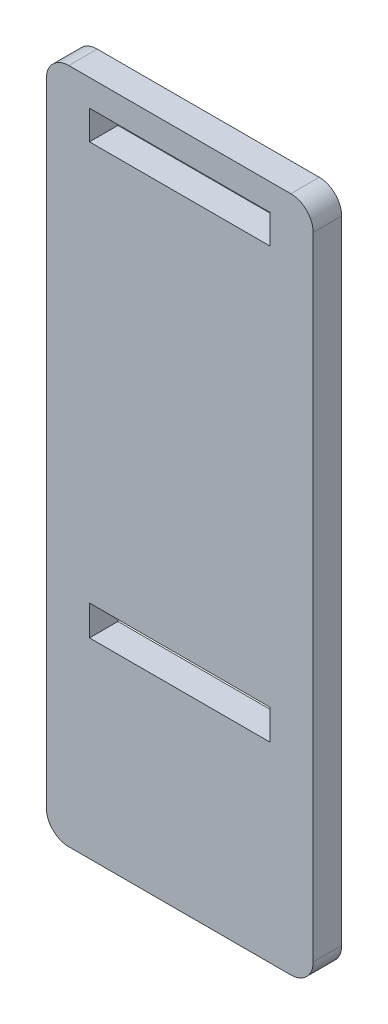
ISO-10303-21;
HEADER;
FILE_DESCRIPTION(('STEP AP214'),'2;1');
FILE_NAME('part.step','',(''),(''),'','','');
FILE_SCHEMA(('AUTOMOTIVE_DESIGN { 1 0 10303 214 1 1 1 1 }'));
ENDSEC;
DATA;
#1=APPLICATION_CONTEXT('core data for automotive mechanical design processes');
#2=APPLICATION_PROTOCOL_DEFINITION('international standard','automotive_design',2000,#1);
#3=PRODUCT_CONTEXT('',#1,'mechanical');
#4=PRODUCT('Part','Part','',(#3));
#5=PRODUCT_RELATED_PRODUCT_CATEGORY('part','',(#4));
#6=PRODUCT_DEFINITION_FORMATION('','',#4);
#7=PRODUCT_DEFINITION_CONTEXT('part definition',#1,'design');
#8=PRODUCT_DEFINITION('design','',#6,#7);
#9=PRODUCT_DEFINITION_SHAPE('','',#8);
#10=(LENGTH_UNIT() NAMED_UNIT(*) SI_UNIT(.MILLI.,.METRE.));
#11=(NAMED_UNIT(*) PLANE_ANGLE_UNIT() SI_UNIT($,.RADIAN.));
#12=(NAMED_UNIT(*) SI_UNIT($,.STERADIAN.) SOLID_ANGLE_UNIT());
#13=UNCERTAINTY_MEASURE_WITH_UNIT(LENGTH_MEASURE(1.E-05),#10,'distance_accuracy_value','');
#14=(GEOMETRIC_REPRESENTATION_CONTEXT(3) GLOBAL_UNCERTAINTY_ASSIGNED_CONTEXT((#13)) GLOBAL_UNIT_ASSIGNED_CONTEXT((#10,
#11,#12)) REPRESENTATION_CONTEXT('',''));
#15=CARTESIAN_POINT('',(0.,0.,0.));
#16=DIRECTION('',(0.,0.,1.));
#17=DIRECTION('',(1.,0.,0.));
#18=AXIS2_PLACEMENT_3D('',#15,#16,#17);
#19=CARTESIAN_POINT('',(49.5,-140.825,-12.7));
#20=DIRECTION('',(0.,0.,1.));
#21=DIRECTION('',(1.,0.,0.));
#22=AXIS2_PLACEMENT_3D('',#19,#20,#21);
#23=CYLINDRICAL_SURFACE('',#22,10.);
#24=CARTESIAN_POINT('',(49.5,-140.825,0.));
#25=DIRECTION('',(0.,0.,1.));
#26=DIRECTION('',(1.,0.,0.));
#27=AXIS2_PLACEMENT_3D('',#24,#25,#26);
#28=CIRCLE('',#27,10.);
#29=CARTESIAN_POINT('',(49.4999999999999,-150.825,0.));
#30=VERTEX_POINT('',#29);
#31=CARTESIAN_POINT('',(59.5,-140.825,0.));
#32=VERTEX_POINT('',#31);
#33=EDGE_CURVE('E216',#30,#32,#28,.T.);
#34=ORIENTED_EDGE('',*,*,#33,.F.);
#35=DIRECTION('',(0.,0.,1.));
#36=VECTOR('',#35,1.);
#37=CARTESIAN_POINT('',(49.4999999999999,-150.825,-12.7));
#38=LINE('',#37,#36);
#39=CARTESIAN_POINT('',(49.4999999999999,-150.825,-12.7));
#40=VERTEX_POINT('',#39);
#41=EDGE_CURVE('E11',#40,#30,#38,.T.);
#42=ORIENTED_EDGE('',*,*,#41,.F.);
#43=CARTESIAN_POINT('',(49.5,-140.825,-12.7));
#44=DIRECTION('',(0.,0.,1.));
#45=DIRECTION('',(1.,0.,0.));
#46=AXIS2_PLACEMENT_3D('',#43,#44,#45);
#47=CIRCLE('',#46,10.);
#48=CARTESIAN_POINT('',(59.5,-140.825,-12.7));
#49=VERTEX_POINT('',#48);
#50=EDGE_CURVE('E223',#40,#49,#47,.T.);
#51=ORIENTED_EDGE('',*,*,#50,.T.);
#52=DIRECTION('',(0.,0.,1.));
#53=VECTOR('',#52,1.);
#54=CARTESIAN_POINT('',(59.5,-140.825,-12.7));
#55=LINE('',#54,#53);
#56=EDGE_CURVE('E44',#49,#32,#55,.T.);
#57=ORIENTED_EDGE('',*,*,#56,.T.);
#58=EDGE_LOOP('',(#34,#42,#51,#57));
#59=FACE_BOUND('',#58,.T.);
#60=ADVANCED_FACE('F41',(#59),#23,.T.);
#61=CARTESIAN_POINT('',(-49.4999999999999,-150.825,-12.7));
#62=DIRECTION('',(0.,-1.,0.));
#63=DIRECTION('',(0.,0.,-1.));
#64=AXIS2_PLACEMENT_3D('',#61,#62,#63);
#65=PLANE('',#64);
#66=DIRECTION('',(1.,0.,0.));
#67=VECTOR('',#66,1.);
#68=CARTESIAN_POINT('',(-49.4999999999999,-150.825,0.));
#69=LINE('',#68,#67);
#70=CARTESIAN_POINT('',(-49.4999999999999,-150.825,0.));
#71=VERTEX_POINT('',#70);
#72=EDGE_CURVE('E227',#71,#30,#69,.T.);
#73=ORIENTED_EDGE('',*,*,#72,.F.);
#74=DIRECTION('',(0.,0.,1.));
#75=VECTOR('',#74,1.);
#76=CARTESIAN_POINT('',(-49.4999999999999,-150.825,-12.7));
#77=LINE('',#76,#75);
#78=CARTESIAN_POINT('',(-49.4999999999999,-150.825,-12.7));
#79=VERTEX_POINT('',#78);
#80=EDGE_CURVE('E49',#79,#71,#77,.T.);
#81=ORIENTED_EDGE('',*,*,#80,.F.);
#82=DIRECTION('',(1.,0.,0.));
#83=VECTOR('',#82,1.);
#84=CARTESIAN_POINT('',(-49.4999999999999,-150.825,-12.7));
#85=LINE('',#84,#83);
#86=EDGE_CURVE('E245',#79,#40,#85,.T.);
#87=ORIENTED_EDGE('',*,*,#86,.T.);
#88=ORIENTED_EDGE('',*,*,#41,.T.);
#89=EDGE_LOOP('',(#73,#81,#87,#88));
#90=FACE_BOUND('',#89,.T.);
#91=ADVANCED_FACE('F292',(#90),#65,.T.);
#92=CARTESIAN_POINT('',(-49.5,-140.825,-12.7));
#93=DIRECTION('',(0.,0.,1.));
#94=DIRECTION('',(1.,0.,0.));
#95=AXIS2_PLACEMENT_3D('',#92,#93,#94);
#96=CYLINDRICAL_SURFACE('',#95,10.);
#97=CARTESIAN_POINT('',(-49.5,-140.825,0.));
#98=DIRECTION('',(0.,0.,1.));
#99=DIRECTION('',(-1.,0.,0.));
#100=AXIS2_PLACEMENT_3D('',#97,#98,#99);
#101=CIRCLE('',#100,10.);
#102=CARTESIAN_POINT('',(-59.5,-140.825,0.));
#103=VERTEX_POINT('',#102);
#104=EDGE_CURVE('E265',#103,#71,#101,.T.);
#105=ORIENTED_EDGE('',*,*,#104,.F.);
#106=DIRECTION('',(0.,0.,1.));
#107=VECTOR('',#106,1.);
#108=CARTESIAN_POINT('',(-59.5,-140.825,-12.7));
#109=LINE('',#108,#107);
#110=CARTESIAN_POINT('',(-59.5,-140.825,-12.7));
#111=VERTEX_POINT('',#110);
#112=EDGE_CURVE('E271',#111,#103,#109,.T.);
#113=ORIENTED_EDGE('',*,*,#112,.F.);
#114=CARTESIAN_POINT('',(-49.5,-140.825,-12.7));
#115=DIRECTION('',(0.,0.,1.));
#116=DIRECTION('',(-1.,0.,0.));
#117=AXIS2_PLACEMENT_3D('',#114,#115,#116);
#118=CIRCLE('',#117,10.);
#119=EDGE_CURVE('E242',#111,#79,#118,.T.);
#120=ORIENTED_EDGE('',*,*,#119,.T.);
#121=ORIENTED_EDGE('',*,*,#80,.T.);
#122=EDGE_LOOP('',(#105,#113,#120,#121));
#123=FACE_BOUND('',#122,.T.);
#124=ADVANCED_FACE('F312',(#123),#96,.T.);
#125=CARTESIAN_POINT('',(-59.5,-140.825,-12.7));
#126=DIRECTION('',(-1.,0.,0.));
#127=DIRECTION('',(0.,0.,1.));
#128=AXIS2_PLACEMENT_3D('',#125,#126,#127);
#129=PLANE('',#128);
#130=DIRECTION('',(0.,-1.,0.));
#131=VECTOR('',#130,1.);
#132=CARTESIAN_POINT('',(-59.5,-140.825,0.));
#133=LINE('',#132,#131);
#134=CARTESIAN_POINT('',(-59.5,140.825,0.));
#135=VERTEX_POINT('',#134);
#136=EDGE_CURVE('E262',#135,#103,#133,.T.);
#137=ORIENTED_EDGE('',*,*,#136,.F.);
#138=DIRECTION('',(0.,0.,1.));
#139=VECTOR('',#138,1.);
#140=CARTESIAN_POINT('',(-59.5,140.825,-12.7));
#141=LINE('',#140,#139);
#142=CARTESIAN_POINT('',(-59.5,140.825,-12.7));
#143=VERTEX_POINT('',#142);
#144=EDGE_CURVE('E273',#143,#135,#141,.T.);
#145=ORIENTED_EDGE('',*,*,#144,.F.);
#146=DIRECTION('',(0.,-1.,0.));
#147=VECTOR('',#146,1.);
#148=CARTESIAN_POINT('',(-59.5,-140.825,-12.7));
#149=LINE('',#148,#147);
#150=EDGE_CURVE('E239',#143,#111,#149,.T.);
#151=ORIENTED_EDGE('',*,*,#150,.T.);
#152=ORIENTED_EDGE('',*,*,#112,.T.);
#153=EDGE_LOOP('',(#137,#145,#151,#152));
#154=FACE_BOUND('',#153,.T.);
#155=ADVANCED_FACE('F310',(#154),#129,.T.);
#156=CARTESIAN_POINT('',(-49.5,140.825,-12.7));
#157=DIRECTION('',(0.,0.,1.));
#158=DIRECTION('',(1.,0.,0.));
#159=AXIS2_PLACEMENT_3D('',#156,#157,#158);
#160=CYLINDRICAL_SURFACE('',#159,10.);
#161=CARTESIAN_POINT('',(-49.5,140.825,0.));
#162=DIRECTION('',(0.,0.,1.));
#163=DIRECTION('',(-1.,0.,0.));
#164=AXIS2_PLACEMENT_3D('',#161,#162,#163);
#165=CIRCLE('',#164,10.);
#166=CARTESIAN_POINT('',(-49.4999999999999,150.825,0.));
#167=VERTEX_POINT('',#166);
#168=EDGE_CURVE('E259',#167,#135,#165,.T.);
#169=ORIENTED_EDGE('',*,*,#168,.F.);
#170=DIRECTION('',(0.,0.,1.));
#171=VECTOR('',#170,1.);
#172=CARTESIAN_POINT('',(-49.4999999999999,150.825,-12.7));
#173=LINE('',#172,#171);
#174=CARTESIAN_POINT('',(-49.4999999999999,150.825,-12.7));
#175=VERTEX_POINT('',#174);
#176=EDGE_CURVE('E275',#175,#167,#173,.T.);
#177=ORIENTED_EDGE('',*,*,#176,.F.);
#178=CARTESIAN_POINT('',(-49.5,140.825,-12.7));
#179=DIRECTION('',(0.,0.,1.));
#180=DIRECTION('',(-1.,0.,0.));
#181=AXIS2_PLACEMENT_3D('',#178,#179,#180);
#182=CIRCLE('',#181,10.);
#183=EDGE_CURVE('E236',#175,#143,#182,.T.);
#184=ORIENTED_EDGE('',*,*,#183,.T.);
#185=ORIENTED_EDGE('',*,*,#144,.T.);
#186=EDGE_LOOP('',(#169,#177,#184,#185));
#187=FACE_BOUND('',#186,.T.);
#188=ADVANCED_FACE('F306',(#187),#160,.T.);
#189=CARTESIAN_POINT('',(-49.4999999999999,150.825,-12.7));
#190=DIRECTION('',(0.,1.,0.));
#191=DIRECTION('',(0.,0.,1.));
#192=AXIS2_PLACEMENT_3D('',#189,#190,#191);
#193=PLANE('',#192);
#194=DIRECTION('',(-1.,0.,0.));
#195=VECTOR('',#194,1.);
#196=CARTESIAN_POINT('',(-49.4999999999999,150.825,0.));
#197=LINE('',#196,#195);
#198=CARTESIAN_POINT('',(49.4999999999999,150.825,0.));
#199=VERTEX_POINT('',#198);
#200=EDGE_CURVE('E256',#199,#167,#197,.T.);
#201=ORIENTED_EDGE('',*,*,#200,.F.);
#202=DIRECTION('',(0.,0.,1.));
#203=VECTOR('',#202,1.);
#204=CARTESIAN_POINT('',(49.4999999999999,150.825,-12.7));
#205=LINE('',#204,#203);
#206=CARTESIAN_POINT('',(49.4999999999999,150.825,-12.7));
#207=VERTEX_POINT('',#206);
#208=EDGE_CURVE('E277',#207,#199,#205,.T.);
#209=ORIENTED_EDGE('',*,*,#208,.F.);
#210=DIRECTION('',(-1.,0.,0.));
#211=VECTOR('',#210,1.);
#212=CARTESIAN_POINT('',(-49.4999999999999,150.825,-12.7));
#213=LINE('',#212,#211);
#214=EDGE_CURVE('E233',#207,#175,#213,.T.);
#215=ORIENTED_EDGE('',*,*,#214,.T.);
#216=ORIENTED_EDGE('',*,*,#176,.T.);
#217=EDGE_LOOP('',(#201,#209,#215,#216));
#218=FACE_BOUND('',#217,.T.);
#219=ADVANCED_FACE('F304',(#218),#193,.T.);
#220=CARTESIAN_POINT('',(49.5,140.825,-12.7));
#221=DIRECTION('',(0.,0.,1.));
#222=DIRECTION('',(1.,0.,0.));
#223=AXIS2_PLACEMENT_3D('',#220,#221,#222);
#224=CYLINDRICAL_SURFACE('',#223,10.);
#225=CARTESIAN_POINT('',(49.5,140.825,0.));
#226=DIRECTION('',(0.,0.,1.));
#227=DIRECTION('',(-1.,0.,0.));
#228=AXIS2_PLACEMENT_3D('',#225,#226,#227);
#229=CIRCLE('',#228,10.);
#230=CARTESIAN_POINT('',(59.5,140.825,0.));
#231=VERTEX_POINT('',#230);
#232=EDGE_CURVE('E253',#231,#199,#229,.T.);
#233=ORIENTED_EDGE('',*,*,#232,.F.);
#234=DIRECTION('',(0.,0.,1.));
#235=VECTOR('',#234,1.);
#236=CARTESIAN_POINT('',(59.5,140.825,-12.7));
#237=LINE('',#236,#235);
#238=CARTESIAN_POINT('',(59.5,140.825,-12.7));
#239=VERTEX_POINT('',#238);
#240=EDGE_CURVE('E278',#239,#231,#237,.T.);
#241=ORIENTED_EDGE('',*,*,#240,.F.);
#242=CARTESIAN_POINT('',(49.5,140.825,-12.7));
#243=DIRECTION('',(0.,0.,1.));
#244=DIRECTION('',(-1.,0.,0.));
#245=AXIS2_PLACEMENT_3D('',#242,#243,#244);
#246=CIRCLE('',#245,10.);
#247=EDGE_CURVE('E230',#239,#207,#246,.T.);
#248=ORIENTED_EDGE('',*,*,#247,.T.);
#249=ORIENTED_EDGE('',*,*,#208,.T.);
#250=EDGE_LOOP('',(#233,#241,#248,#249));
#251=FACE_BOUND('',#250,.T.);
#252=ADVANCED_FACE('F300',(#251),#224,.T.);
#253=CARTESIAN_POINT('',(59.5,-140.825,-12.7));
#254=DIRECTION('',(1.,0.,0.));
#255=DIRECTION('',(0.,0.,-1.));
#256=AXIS2_PLACEMENT_3D('',#253,#254,#255);
#257=PLANE('',#256);
#258=DIRECTION('',(0.,1.,0.));
#259=VECTOR('',#258,1.);
#260=CARTESIAN_POINT('',(59.5,-140.825,0.));
#261=LINE('',#260,#259);
#262=EDGE_CURVE('E250',#32,#231,#261,.T.);
#263=ORIENTED_EDGE('',*,*,#262,.F.);
#264=ORIENTED_EDGE('',*,*,#56,.F.);
#265=DIRECTION('',(0.,1.,0.));
#266=VECTOR('',#265,1.);
#267=CARTESIAN_POINT('',(59.5,-140.825,-12.7));
#268=LINE('',#267,#266);
#269=EDGE_CURVE('E226',#49,#239,#268,.T.);
#270=ORIENTED_EDGE('',*,*,#269,.T.);
#271=ORIENTED_EDGE('',*,*,#240,.T.);
#272=EDGE_LOOP('',(#263,#264,#270,#271));
#273=FACE_BOUND('',#272,.T.);
#274=ADVANCED_FACE('F286',(#273),#257,.T.);
#275=CARTESIAN_POINT('',(49.5,-140.825,-12.7));
#276=DIRECTION('',(0.,0.,1.));
#277=DIRECTION('',(1.,0.,0.));
#278=AXIS2_PLACEMENT_3D('',#275,#276,#277);
#279=PLANE('',#278);
#280=DIRECTION('',(-1.,0.,0.));
#281=VECTOR('',#280,1.);
#282=CARTESIAN_POINT('',(40.25,-52.0838408616782,-12.7));
#283=LINE('',#282,#281);
#284=CARTESIAN_POINT('',(40.25,-52.0838408616782,-12.7));
#285=VERTEX_POINT('',#284);
#286=CARTESIAN_POINT('',(-40.25,-52.0838408616782,-12.7));
#287=VERTEX_POINT('',#286);
#288=EDGE_CURVE('E162',#285,#287,#283,.T.);
#289=ORIENTED_EDGE('',*,*,#288,.T.);
#290=DIRECTION('',(0.,-1.,0.));
#291=VECTOR('',#290,1.);
#292=CARTESIAN_POINT('',(-40.25,-52.0838408616782,-12.7));
#293=LINE('',#292,#291);
#294=CARTESIAN_POINT('',(-40.25,-65.5661591383219,-12.7));
#295=VERTEX_POINT('',#294);
#296=EDGE_CURVE('E156',#287,#295,#293,.T.);
#297=ORIENTED_EDGE('',*,*,#296,.T.);
#298=DIRECTION('',(1.,0.,0.));
#299=VECTOR('',#298,1.);
#300=CARTESIAN_POINT('',(40.25,-65.5661591383219,-12.7));
#301=LINE('',#300,#299);
#302=CARTESIAN_POINT('',(40.25,-65.5661591383219,-12.7));
#303=VERTEX_POINT('',#302);
#304=EDGE_CURVE('E165',#295,#303,#301,.T.);
#305=ORIENTED_EDGE('',*,*,#304,.T.);
#306=DIRECTION('',(0.,1.,0.));
#307=VECTOR('',#306,1.);
#308=CARTESIAN_POINT('',(40.25,-52.0838408616782,-12.7));
#309=LINE('',#308,#307);
#310=EDGE_CURVE('E57',#303,#285,#309,.T.);
#311=ORIENTED_EDGE('',*,*,#310,.T.);
#312=EDGE_LOOP('',(#289,#297,#305,#311));
#313=FACE_BOUND('',#312,.T.);
#314=DIRECTION('',(-1.,0.,0.));
#315=VECTOR('',#314,1.);
#316=CARTESIAN_POINT('',(40.25,138.975,-12.7));
#317=LINE('',#316,#315);
#318=CARTESIAN_POINT('',(40.25,138.975,-12.7));
#319=VERTEX_POINT('',#318);
#320=CARTESIAN_POINT('',(-40.25,138.975,-12.7));
#321=VERTEX_POINT('',#320);
#322=EDGE_CURVE('E201',#319,#321,#317,.T.);
#323=ORIENTED_EDGE('',*,*,#322,.T.);
#324=DIRECTION('',(0.,-1.,0.));
#325=VECTOR('',#324,1.);
#326=CARTESIAN_POINT('',(-40.25,138.975,-12.7));
#327=LINE('',#326,#325);
#328=CARTESIAN_POINT('',(-40.25,125.975,-12.7));
#329=VERTEX_POINT('',#328);
#330=EDGE_CURVE('E191',#321,#329,#327,.T.);
#331=ORIENTED_EDGE('',*,*,#330,.T.);
#332=DIRECTION('',(1.,0.,0.));
#333=VECTOR('',#332,1.);
#334=CARTESIAN_POINT('',(40.25,125.975,-12.7));
#335=LINE('',#334,#333);
#336=CARTESIAN_POINT('',(40.25,125.975,-12.7));
#337=VERTEX_POINT('',#336);
#338=EDGE_CURVE('E194',#329,#337,#335,.T.);
#339=ORIENTED_EDGE('',*,*,#338,.T.);
#340=DIRECTION('',(0.,1.,0.));
#341=VECTOR('',#340,1.);
#342=CARTESIAN_POINT('',(40.25,138.975,-12.7));
#343=LINE('',#342,#341);
#344=EDGE_CURVE('E198',#337,#319,#343,.T.);
#345=ORIENTED_EDGE('',*,*,#344,.T.);
#346=EDGE_LOOP('',(#323,#331,#339,#345));
#347=FACE_BOUND('',#346,.T.);
#348=ORIENTED_EDGE('',*,*,#50,.F.);
#349=ORIENTED_EDGE('',*,*,#86,.F.);
#350=ORIENTED_EDGE('',*,*,#119,.F.);
#351=ORIENTED_EDGE('',*,*,#150,.F.);
#352=ORIENTED_EDGE('',*,*,#183,.F.);
#353=ORIENTED_EDGE('',*,*,#214,.F.);
#354=ORIENTED_EDGE('',*,*,#247,.F.);
#355=ORIENTED_EDGE('',*,*,#269,.F.);
#356=EDGE_LOOP('',(#348,#349,#350,#351,#352,#353,#354,#355));
#357=FACE_BOUND('',#356,.T.);
#358=ADVANCED_FACE('F169',(#313,#347,#357),#279,.F.);
#359=CARTESIAN_POINT('',(49.5,-140.825,0.));
#360=DIRECTION('',(0.,0.,1.));
#361=DIRECTION('',(1.,0.,0.));
#362=AXIS2_PLACEMENT_3D('',#359,#360,#361);
#363=PLANE('',#362);
#364=DIRECTION('',(0.,-1.,0.));
#365=VECTOR('',#364,1.);
#366=CARTESIAN_POINT('',(-40.25,-52.0838408616782,0.));
#367=LINE('',#366,#365);
#368=CARTESIAN_POINT('',(-40.25,-52.0838408616782,0.));
#369=VERTEX_POINT('',#368);
#370=CARTESIAN_POINT('',(-40.25,-65.5661591383219,0.));
#371=VERTEX_POINT('',#370);
#372=EDGE_CURVE('E65',#369,#371,#367,.T.);
#373=ORIENTED_EDGE('',*,*,#372,.F.);
#374=DIRECTION('',(-1.,0.,0.));
#375=VECTOR('',#374,1.);
#376=CARTESIAN_POINT('',(40.25,-52.0838408616782,0.));
#377=LINE('',#376,#375);
#378=CARTESIAN_POINT('',(40.25,-52.0838408616782,0.));
#379=VERTEX_POINT('',#378);
#380=EDGE_CURVE('E172',#379,#369,#377,.T.);
#381=ORIENTED_EDGE('',*,*,#380,.F.);
#382=DIRECTION('',(0.,1.,0.));
#383=VECTOR('',#382,1.);
#384=CARTESIAN_POINT('',(40.25,-52.0838408616782,0.));
#385=LINE('',#384,#383);
#386=CARTESIAN_POINT('',(40.25,-65.5661591383219,0.));
#387=VERTEX_POINT('',#386);
#388=EDGE_CURVE('E175',#387,#379,#385,.T.);
#389=ORIENTED_EDGE('',*,*,#388,.F.);
#390=DIRECTION('',(1.,0.,0.));
#391=VECTOR('',#390,1.);
#392=CARTESIAN_POINT('',(40.25,-65.5661591383219,0.));
#393=LINE('',#392,#391);
#394=EDGE_CURVE('E181',#371,#387,#393,.T.);
#395=ORIENTED_EDGE('',*,*,#394,.F.);
#396=EDGE_LOOP('',(#373,#381,#389,#395));
#397=FACE_BOUND('',#396,.T.);
#398=DIRECTION('',(0.,-1.,0.));
#399=VECTOR('',#398,1.);
#400=CARTESIAN_POINT('',(-40.25,138.975,0.));
#401=LINE('',#400,#399);
#402=CARTESIAN_POINT('',(-40.25,138.975,0.));
#403=VERTEX_POINT('',#402);
#404=CARTESIAN_POINT('',(-40.25,125.975,0.));
#405=VERTEX_POINT('',#404);
#406=EDGE_CURVE('E187',#403,#405,#401,.T.);
#407=ORIENTED_EDGE('',*,*,#406,.F.);
#408=DIRECTION('',(-1.,0.,0.));
#409=VECTOR('',#408,1.);
#410=CARTESIAN_POINT('',(40.25,138.975,0.));
#411=LINE('',#410,#409);
#412=CARTESIAN_POINT('',(40.25,138.975,0.));
#413=VERTEX_POINT('',#412);
#414=EDGE_CURVE('E195',#413,#403,#411,.T.);
#415=ORIENTED_EDGE('',*,*,#414,.F.);
#416=DIRECTION('',(0.,1.,0.));
#417=VECTOR('',#416,1.);
#418=CARTESIAN_POINT('',(40.25,138.975,0.));
#419=LINE('',#418,#417);
#420=CARTESIAN_POINT('',(40.25,125.975,0.));
#421=VERTEX_POINT('',#420);
#422=EDGE_CURVE('E209',#421,#413,#419,.T.);
#423=ORIENTED_EDGE('',*,*,#422,.F.);
#424=DIRECTION('',(1.,0.,0.));
#425=VECTOR('',#424,1.);
#426=CARTESIAN_POINT('',(40.25,125.975,0.));
#427=LINE('',#426,#425);
#428=EDGE_CURVE('E206',#405,#421,#427,.T.);
#429=ORIENTED_EDGE('',*,*,#428,.F.);
#430=EDGE_LOOP('',(#407,#415,#423,#429));
#431=FACE_BOUND('',#430,.T.);
#432=ORIENTED_EDGE('',*,*,#33,.T.);
#433=ORIENTED_EDGE('',*,*,#262,.T.);
#434=ORIENTED_EDGE('',*,*,#232,.T.);
#435=ORIENTED_EDGE('',*,*,#200,.T.);
#436=ORIENTED_EDGE('',*,*,#168,.T.);
#437=ORIENTED_EDGE('',*,*,#136,.T.);
#438=ORIENTED_EDGE('',*,*,#104,.T.);
#439=ORIENTED_EDGE('',*,*,#72,.T.);
#440=EDGE_LOOP('',(#432,#433,#434,#435,#436,#437,#438,#439));
#441=FACE_BOUND('',#440,.T.);
#442=ADVANCED_FACE('F288',(#397,#431,#441),#363,.T.);
#443=CARTESIAN_POINT('',(-40.25,138.975,-12.7));
#444=DIRECTION('',(-1.,0.,0.));
#445=DIRECTION('',(0.,0.,1.));
#446=AXIS2_PLACEMENT_3D('',#443,#444,#445);
#447=PLANE('',#446);
#448=ORIENTED_EDGE('',*,*,#406,.T.);
#449=DIRECTION('',(0.,0.,1.));
#450=VECTOR('',#449,1.);
#451=CARTESIAN_POINT('',(-40.25,125.975,-12.7));
#452=LINE('',#451,#450);
#453=EDGE_CURVE('E204',#329,#405,#452,.T.);
#454=ORIENTED_EDGE('',*,*,#453,.F.);
#455=ORIENTED_EDGE('',*,*,#330,.F.);
#456=DIRECTION('',(0.,0.,1.));
#457=VECTOR('',#456,1.);
#458=CARTESIAN_POINT('',(-40.25,138.975,-12.7));
#459=LINE('',#458,#457);
#460=EDGE_CURVE('E214',#321,#403,#459,.T.);
#461=ORIENTED_EDGE('',*,*,#460,.T.);
#462=EDGE_LOOP('',(#448,#454,#455,#461));
#463=FACE_BOUND('',#462,.T.);
#464=ADVANCED_FACE('F396',(#463),#447,.F.);
#465=CARTESIAN_POINT('',(40.25,138.975,-12.7));
#466=DIRECTION('',(0.,1.,0.));
#467=DIRECTION('',(0.,0.,1.));
#468=AXIS2_PLACEMENT_3D('',#465,#466,#467);
#469=PLANE('',#468);
#470=ORIENTED_EDGE('',*,*,#414,.T.);
#471=ORIENTED_EDGE('',*,*,#460,.F.);
#472=ORIENTED_EDGE('',*,*,#322,.F.);
#473=DIRECTION('',(0.,0.,1.));
#474=VECTOR('',#473,1.);
#475=CARTESIAN_POINT('',(40.25,138.975,-12.7));
#476=LINE('',#475,#474);
#477=EDGE_CURVE('E217',#319,#413,#476,.T.);
#478=ORIENTED_EDGE('',*,*,#477,.T.);
#479=EDGE_LOOP('',(#470,#471,#472,#478));
#480=FACE_BOUND('',#479,.T.);
#481=ADVANCED_FACE('F407',(#480),#469,.F.);
#482=CARTESIAN_POINT('',(40.25,138.975,-12.7));
#483=DIRECTION('',(1.,0.,0.));
#484=DIRECTION('',(0.,0.,-1.));
#485=AXIS2_PLACEMENT_3D('',#482,#483,#484);
#486=PLANE('',#485);
#487=ORIENTED_EDGE('',*,*,#422,.T.);
#488=ORIENTED_EDGE('',*,*,#477,.F.);
#489=ORIENTED_EDGE('',*,*,#344,.F.);
#490=DIRECTION('',(0.,0.,1.));
#491=VECTOR('',#490,1.);
#492=CARTESIAN_POINT('',(40.25,125.975,-12.7));
#493=LINE('',#492,#491);
#494=EDGE_CURVE('E219',#337,#421,#493,.T.);
#495=ORIENTED_EDGE('',*,*,#494,.T.);
#496=EDGE_LOOP('',(#487,#488,#489,#495));
#497=FACE_BOUND('',#496,.T.);
#498=ADVANCED_FACE('F418',(#497),#486,.F.);
#499=CARTESIAN_POINT('',(40.25,125.975,-12.7));
#500=DIRECTION('',(0.,-1.,0.));
#501=DIRECTION('',(0.,0.,-1.));
#502=AXIS2_PLACEMENT_3D('',#499,#500,#501);
#503=PLANE('',#502);
#504=ORIENTED_EDGE('',*,*,#428,.T.);
#505=ORIENTED_EDGE('',*,*,#494,.F.);
#506=ORIENTED_EDGE('',*,*,#338,.F.);
#507=ORIENTED_EDGE('',*,*,#453,.T.);
#508=EDGE_LOOP('',(#504,#505,#506,#507));
#509=FACE_BOUND('',#508,.T.);
#510=ADVANCED_FACE('F429',(#509),#503,.F.);
#511=CARTESIAN_POINT('',(-40.25,-52.0838408616782,-12.7));
#512=DIRECTION('',(-1.,0.,0.));
#513=DIRECTION('',(0.,-1.,0.));
#514=AXIS2_PLACEMENT_3D('',#511,#512,#513);
#515=PLANE('',#514);
#516=ORIENTED_EDGE('',*,*,#372,.T.);
#517=DIRECTION('',(0.,0.,1.));
#518=VECTOR('',#517,1.);
#519=CARTESIAN_POINT('',(-40.25,-65.5661591383219,-12.7));
#520=LINE('',#519,#518);
#521=EDGE_CURVE('E152',#295,#371,#520,.T.);
#522=ORIENTED_EDGE('',*,*,#521,.F.);
#523=ORIENTED_EDGE('',*,*,#296,.F.);
#524=DIRECTION('',(0.,0.,1.));
#525=VECTOR('',#524,1.);
#526=CARTESIAN_POINT('',(-40.25,-52.0838408616782,-12.7));
#527=LINE('',#526,#525);
#528=EDGE_CURVE('E185',#287,#369,#527,.T.);
#529=ORIENTED_EDGE('',*,*,#528,.T.);
#530=EDGE_LOOP('',(#516,#522,#523,#529));
#531=FACE_BOUND('',#530,.T.);
#532=ADVANCED_FACE('F154',(#531),#515,.F.);
#533=CARTESIAN_POINT('',(40.25,-52.0838408616782,-12.7));
#534=DIRECTION('',(0.,1.,0.));
#535=DIRECTION('',(-1.,0.,0.));
#536=AXIS2_PLACEMENT_3D('',#533,#534,#535);
#537=PLANE('',#536);
#538=ORIENTED_EDGE('',*,*,#380,.T.);
#539=ORIENTED_EDGE('',*,*,#528,.F.);
#540=ORIENTED_EDGE('',*,*,#288,.F.);
#541=DIRECTION('',(0.,0.,1.));
#542=VECTOR('',#541,1.);
#543=CARTESIAN_POINT('',(40.25,-52.0838408616782,-12.7));
#544=LINE('',#543,#542);
#545=EDGE_CURVE('E188',#285,#379,#544,.T.);
#546=ORIENTED_EDGE('',*,*,#545,.T.);
#547=EDGE_LOOP('',(#538,#539,#540,#546));
#548=FACE_BOUND('',#547,.T.);
#549=ADVANCED_FACE('F450',(#548),#537,.F.);
#550=CARTESIAN_POINT('',(40.25,-52.0838408616782,-12.7));
#551=DIRECTION('',(1.,0.,0.));
#552=DIRECTION('',(0.,1.,0.));
#553=AXIS2_PLACEMENT_3D('',#550,#551,#552);
#554=PLANE('',#553);
#555=ORIENTED_EDGE('',*,*,#388,.T.);
#556=ORIENTED_EDGE('',*,*,#545,.F.);
#557=ORIENTED_EDGE('',*,*,#310,.F.);
#558=DIRECTION('',(0.,0.,1.));
#559=VECTOR('',#558,1.);
#560=CARTESIAN_POINT('',(40.25,-65.5661591383219,-12.7));
#561=LINE('',#560,#559);
#562=EDGE_CURVE('E161',#303,#387,#561,.T.);
#563=ORIENTED_EDGE('',*,*,#562,.T.);
#564=EDGE_LOOP('',(#555,#556,#557,#563));
#565=FACE_BOUND('',#564,.T.);
#566=ADVANCED_FACE('F460',(#565),#554,.F.);
#567=CARTESIAN_POINT('',(40.25,-65.5661591383219,-12.7));
#568=DIRECTION('',(0.,-1.,0.));
#569=DIRECTION('',(1.,0.,0.));
#570=AXIS2_PLACEMENT_3D('',#567,#568,#569);
#571=PLANE('',#570);
#572=ORIENTED_EDGE('',*,*,#394,.T.);
#573=ORIENTED_EDGE('',*,*,#562,.F.);
#574=ORIENTED_EDGE('',*,*,#304,.F.);
#575=ORIENTED_EDGE('',*,*,#521,.T.);
#576=EDGE_LOOP('',(#572,#573,#574,#575));
#577=FACE_BOUND('',#576,.T.);
#578=ADVANCED_FACE('F166',(#577),#571,.F.);
#579=CLOSED_SHELL('',(#60,#91,#124,#155,#188,#219,#252,#274,#358,#442,#464,#481,#498,#510,#532,
#549,#566,#578));
#580=MANIFOLD_SOLID_BREP('B2',#579);
#581=ADVANCED_BREP_SHAPE_REPRESENTATION('',(#18,#580),#14);
#582=SHAPE_DEFINITION_REPRESENTATION(#9,#581);
ENDSEC;
END-ISO-10303-21;
